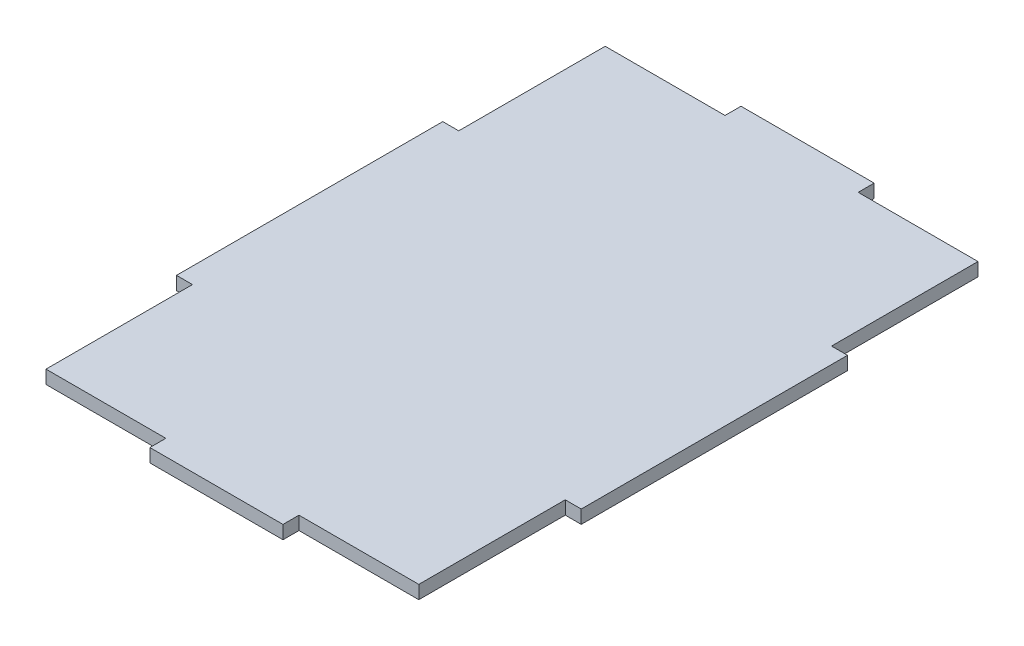
ISO-10303-21;
HEADER;
FILE_DESCRIPTION(('STEP AP214'),'2;1');
FILE_NAME('part.step','',(''),(''),'','','');
FILE_SCHEMA(('AUTOMOTIVE_DESIGN { 1 0 10303 214 1 1 1 1 }'));
ENDSEC;
DATA;
#1=APPLICATION_CONTEXT('core data for automotive mechanical design processes');
#2=APPLICATION_PROTOCOL_DEFINITION('international standard','automotive_design',2000,#1);
#3=PRODUCT_CONTEXT('',#1,'mechanical');
#4=PRODUCT('Part','Part','',(#3));
#5=PRODUCT_RELATED_PRODUCT_CATEGORY('part','',(#4));
#6=PRODUCT_DEFINITION_FORMATION('','',#4);
#7=PRODUCT_DEFINITION_CONTEXT('part definition',#1,'design');
#8=PRODUCT_DEFINITION('design','',#6,#7);
#9=PRODUCT_DEFINITION_SHAPE('','',#8);
#10=(LENGTH_UNIT() NAMED_UNIT(*) SI_UNIT(.MILLI.,.METRE.));
#11=(NAMED_UNIT(*) PLANE_ANGLE_UNIT() SI_UNIT($,.RADIAN.));
#12=(NAMED_UNIT(*) SI_UNIT($,.STERADIAN.) SOLID_ANGLE_UNIT());
#13=UNCERTAINTY_MEASURE_WITH_UNIT(LENGTH_MEASURE(1.E-05),#10,'distance_accuracy_value','');
#14=(GEOMETRIC_REPRESENTATION_CONTEXT(3) GLOBAL_UNCERTAINTY_ASSIGNED_CONTEXT((#13)) GLOBAL_UNIT_ASSIGNED_CONTEXT((#10,
#11,#12)) REPRESENTATION_CONTEXT('',''));
#15=CARTESIAN_POINT('',(0.,0.,0.));
#16=DIRECTION('',(0.,0.,1.));
#17=DIRECTION('',(1.,0.,0.));
#18=AXIS2_PLACEMENT_3D('',#15,#16,#17);
#19=CARTESIAN_POINT('',(-15.875,3.175,-66.675));
#20=DIRECTION('',(0.,0.,1.));
#21=DIRECTION('',(1.,0.,0.));
#22=AXIS2_PLACEMENT_3D('',#19,#20,#21);
#23=PLANE('',#22);
#24=DIRECTION('',(-1.,0.,0.));
#25=VECTOR('',#24,1.);
#26=CARTESIAN_POINT('',(-15.875,0.,-66.675));
#27=LINE('',#26,#25);
#28=CARTESIAN_POINT('',(-15.875,0.,-66.675));
#29=VERTEX_POINT('',#28);
#30=CARTESIAN_POINT('',(-44.45,0.,-66.675));
#31=VERTEX_POINT('',#30);
#32=EDGE_CURVE('E203',#29,#31,#27,.T.);
#33=ORIENTED_EDGE('',*,*,#32,.T.);
#34=DIRECTION('',(0.,-1.,0.));
#35=VECTOR('',#34,1.);
#36=CARTESIAN_POINT('',(-44.45,3.175,-66.675));
#37=LINE('',#36,#35);
#38=CARTESIAN_POINT('',(-44.45,3.175,-66.675));
#39=VERTEX_POINT('',#38);
#40=EDGE_CURVE('E11',#39,#31,#37,.T.);
#41=ORIENTED_EDGE('',*,*,#40,.F.);
#42=DIRECTION('',(-1.,0.,0.));
#43=VECTOR('',#42,1.);
#44=CARTESIAN_POINT('',(-15.875,3.175,-66.675));
#45=LINE('',#44,#43);
#46=CARTESIAN_POINT('',(-15.875,3.175,-66.675));
#47=VERTEX_POINT('',#46);
#48=EDGE_CURVE('E241',#47,#39,#45,.T.);
#49=ORIENTED_EDGE('',*,*,#48,.F.);
#50=DIRECTION('',(0.,-1.,0.));
#51=VECTOR('',#50,1.);
#52=CARTESIAN_POINT('',(-15.875,3.175,-66.675));
#53=LINE('',#52,#51);
#54=EDGE_CURVE('E199',#47,#29,#53,.T.);
#55=ORIENTED_EDGE('',*,*,#54,.T.);
#56=EDGE_LOOP('',(#33,#41,#49,#55));
#57=FACE_BOUND('',#56,.T.);
#58=ADVANCED_FACE('F35',(#57),#23,.F.);
#59=CARTESIAN_POINT('',(-44.45,3.175,-66.675));
#60=DIRECTION('',(1.,0.,0.));
#61=DIRECTION('',(0.,0.,-1.));
#62=AXIS2_PLACEMENT_3D('',#59,#60,#61);
#63=PLANE('',#62);
#64=DIRECTION('',(0.,0.,1.));
#65=VECTOR('',#64,1.);
#66=CARTESIAN_POINT('',(-44.45,0.,-66.675));
#67=LINE('',#66,#65);
#68=CARTESIAN_POINT('',(-44.45,0.,-31.75));
#69=VERTEX_POINT('',#68);
#70=EDGE_CURVE('E206',#31,#69,#67,.T.);
#71=ORIENTED_EDGE('',*,*,#70,.T.);
#72=DIRECTION('',(0.,-1.,0.));
#73=VECTOR('',#72,1.);
#74=CARTESIAN_POINT('',(-44.45,3.175,-31.75));
#75=LINE('',#74,#73);
#76=CARTESIAN_POINT('',(-44.45,3.175,-31.75));
#77=VERTEX_POINT('',#76);
#78=EDGE_CURVE('E43',#77,#69,#75,.T.);
#79=ORIENTED_EDGE('',*,*,#78,.F.);
#80=DIRECTION('',(0.,0.,1.));
#81=VECTOR('',#80,1.);
#82=CARTESIAN_POINT('',(-44.45,3.175,-66.675));
#83=LINE('',#82,#81);
#84=EDGE_CURVE('E130',#39,#77,#83,.T.);
#85=ORIENTED_EDGE('',*,*,#84,.F.);
#86=ORIENTED_EDGE('',*,*,#40,.T.);
#87=EDGE_LOOP('',(#71,#79,#85,#86));
#88=FACE_BOUND('',#87,.T.);
#89=ADVANCED_FACE('F359',(#88),#63,.F.);
#90=CARTESIAN_POINT('',(-44.45,3.175,-31.75));
#91=DIRECTION('',(0.,0.,1.));
#92=DIRECTION('',(1.,0.,0.));
#93=AXIS2_PLACEMENT_3D('',#90,#91,#92);
#94=PLANE('',#93);
#95=DIRECTION('',(-1.,0.,0.));
#96=VECTOR('',#95,1.);
#97=CARTESIAN_POINT('',(-44.45,0.,-31.75));
#98=LINE('',#97,#96);
#99=CARTESIAN_POINT('',(-48.26,0.,-31.75));
#100=VERTEX_POINT('',#99);
#101=EDGE_CURVE('E208',#69,#100,#98,.T.);
#102=ORIENTED_EDGE('',*,*,#101,.T.);
#103=DIRECTION('',(0.,-1.,0.));
#104=VECTOR('',#103,1.);
#105=CARTESIAN_POINT('',(-48.26,3.175,-31.75));
#106=LINE('',#105,#104);
#107=CARTESIAN_POINT('',(-48.26,3.175,-31.75));
#108=VERTEX_POINT('',#107);
#109=EDGE_CURVE('E284',#108,#100,#106,.T.);
#110=ORIENTED_EDGE('',*,*,#109,.F.);
#111=DIRECTION('',(-1.,0.,0.));
#112=VECTOR('',#111,1.);
#113=CARTESIAN_POINT('',(-44.45,3.175,-31.75));
#114=LINE('',#113,#112);
#115=EDGE_CURVE('E292',#77,#108,#114,.T.);
#116=ORIENTED_EDGE('',*,*,#115,.F.);
#117=ORIENTED_EDGE('',*,*,#78,.T.);
#118=EDGE_LOOP('',(#102,#110,#116,#117));
#119=FACE_BOUND('',#118,.T.);
#120=ADVANCED_FACE('F290',(#119),#94,.F.);
#121=CARTESIAN_POINT('',(-48.26,3.175,-31.75));
#122=DIRECTION('',(1.,0.,0.));
#123=DIRECTION('',(0.,0.,-1.));
#124=AXIS2_PLACEMENT_3D('',#121,#122,#123);
#125=PLANE('',#124);
#126=DIRECTION('',(0.,0.,1.));
#127=VECTOR('',#126,1.);
#128=CARTESIAN_POINT('',(-48.26,0.,-31.75));
#129=LINE('',#128,#127);
#130=CARTESIAN_POINT('',(-48.26,0.,31.75));
#131=VERTEX_POINT('',#130);
#132=EDGE_CURVE('E210',#100,#131,#129,.T.);
#133=ORIENTED_EDGE('',*,*,#132,.T.);
#134=DIRECTION('',(0.,-1.,0.));
#135=VECTOR('',#134,1.);
#136=CARTESIAN_POINT('',(-48.26,3.175,31.75));
#137=LINE('',#136,#135);
#138=CARTESIAN_POINT('',(-48.26,3.175,31.75));
#139=VERTEX_POINT('',#138);
#140=EDGE_CURVE('E281',#139,#131,#137,.T.);
#141=ORIENTED_EDGE('',*,*,#140,.F.);
#142=DIRECTION('',(0.,0.,1.));
#143=VECTOR('',#142,1.);
#144=CARTESIAN_POINT('',(-48.26,3.175,-31.75));
#145=LINE('',#144,#143);
#146=EDGE_CURVE('E310',#108,#139,#145,.T.);
#147=ORIENTED_EDGE('',*,*,#146,.F.);
#148=ORIENTED_EDGE('',*,*,#109,.T.);
#149=EDGE_LOOP('',(#133,#141,#147,#148));
#150=FACE_BOUND('',#149,.T.);
#151=ADVANCED_FACE('F301',(#150),#125,.F.);
#152=CARTESIAN_POINT('',(-44.45,3.175,31.75));
#153=DIRECTION('',(0.,0.,-1.));
#154=DIRECTION('',(-1.,0.,0.));
#155=AXIS2_PLACEMENT_3D('',#152,#153,#154);
#156=PLANE('',#155);
#157=DIRECTION('',(1.,0.,0.));
#158=VECTOR('',#157,1.);
#159=CARTESIAN_POINT('',(-44.45,0.,31.75));
#160=LINE('',#159,#158);
#161=CARTESIAN_POINT('',(-44.45,0.,31.75));
#162=VERTEX_POINT('',#161);
#163=EDGE_CURVE('E212',#131,#162,#160,.T.);
#164=ORIENTED_EDGE('',*,*,#163,.T.);
#165=DIRECTION('',(0.,-1.,0.));
#166=VECTOR('',#165,1.);
#167=CARTESIAN_POINT('',(-44.45,3.175,31.75));
#168=LINE('',#167,#166);
#169=CARTESIAN_POINT('',(-44.45,3.175,31.75));
#170=VERTEX_POINT('',#169);
#171=EDGE_CURVE('E278',#170,#162,#168,.T.);
#172=ORIENTED_EDGE('',*,*,#171,.F.);
#173=DIRECTION('',(1.,0.,0.));
#174=VECTOR('',#173,1.);
#175=CARTESIAN_POINT('',(-44.45,3.175,31.75));
#176=LINE('',#175,#174);
#177=EDGE_CURVE('E307',#139,#170,#176,.T.);
#178=ORIENTED_EDGE('',*,*,#177,.F.);
#179=ORIENTED_EDGE('',*,*,#140,.T.);
#180=EDGE_LOOP('',(#164,#172,#178,#179));
#181=FACE_BOUND('',#180,.T.);
#182=ADVANCED_FACE('F305',(#181),#156,.F.);
#183=CARTESIAN_POINT('',(-44.45,3.175,31.75));
#184=DIRECTION('',(1.,0.,0.));
#185=DIRECTION('',(0.,0.,-1.));
#186=AXIS2_PLACEMENT_3D('',#183,#184,#185);
#187=PLANE('',#186);
#188=DIRECTION('',(0.,0.,1.));
#189=VECTOR('',#188,1.);
#190=CARTESIAN_POINT('',(-44.45,0.,31.75));
#191=LINE('',#190,#189);
#192=CARTESIAN_POINT('',(-44.45,0.,66.675));
#193=VERTEX_POINT('',#192);
#194=EDGE_CURVE('E214',#162,#193,#191,.T.);
#195=ORIENTED_EDGE('',*,*,#194,.T.);
#196=DIRECTION('',(0.,-1.,0.));
#197=VECTOR('',#196,1.);
#198=CARTESIAN_POINT('',(-44.45,3.175,66.675));
#199=LINE('',#198,#197);
#200=CARTESIAN_POINT('',(-44.45,3.175,66.675));
#201=VERTEX_POINT('',#200);
#202=EDGE_CURVE('E275',#201,#193,#199,.T.);
#203=ORIENTED_EDGE('',*,*,#202,.F.);
#204=DIRECTION('',(0.,0.,1.));
#205=VECTOR('',#204,1.);
#206=CARTESIAN_POINT('',(-44.45,3.175,31.75));
#207=LINE('',#206,#205);
#208=EDGE_CURVE('E309',#170,#201,#207,.T.);
#209=ORIENTED_EDGE('',*,*,#208,.F.);
#210=ORIENTED_EDGE('',*,*,#171,.T.);
#211=EDGE_LOOP('',(#195,#203,#209,#210));
#212=FACE_BOUND('',#211,.T.);
#213=ADVANCED_FACE('F372',(#212),#187,.F.);
#214=CARTESIAN_POINT('',(-44.45,3.175,66.675));
#215=DIRECTION('',(0.,0.,-1.));
#216=DIRECTION('',(-1.,0.,0.));
#217=AXIS2_PLACEMENT_3D('',#214,#215,#216);
#218=PLANE('',#217);
#219=DIRECTION('',(1.,0.,0.));
#220=VECTOR('',#219,1.);
#221=CARTESIAN_POINT('',(-44.45,0.,66.675));
#222=LINE('',#221,#220);
#223=CARTESIAN_POINT('',(-15.875,0.,66.675));
#224=VERTEX_POINT('',#223);
#225=EDGE_CURVE('E216',#193,#224,#222,.T.);
#226=ORIENTED_EDGE('',*,*,#225,.T.);
#227=DIRECTION('',(0.,-1.,0.));
#228=VECTOR('',#227,1.);
#229=CARTESIAN_POINT('',(-15.875,3.175,66.675));
#230=LINE('',#229,#228);
#231=CARTESIAN_POINT('',(-15.875,3.175,66.675));
#232=VERTEX_POINT('',#231);
#233=EDGE_CURVE('E272',#232,#224,#230,.T.);
#234=ORIENTED_EDGE('',*,*,#233,.F.);
#235=DIRECTION('',(1.,0.,0.));
#236=VECTOR('',#235,1.);
#237=CARTESIAN_POINT('',(-44.45,3.175,66.675));
#238=LINE('',#237,#236);
#239=EDGE_CURVE('E312',#201,#232,#238,.T.);
#240=ORIENTED_EDGE('',*,*,#239,.F.);
#241=ORIENTED_EDGE('',*,*,#202,.T.);
#242=EDGE_LOOP('',(#226,#234,#240,#241));
#243=FACE_BOUND('',#242,.T.);
#244=ADVANCED_FACE('F375',(#243),#218,.F.);
#245=CARTESIAN_POINT('',(-15.875,3.175,66.675));
#246=DIRECTION('',(1.,0.,0.));
#247=DIRECTION('',(0.,0.,-1.));
#248=AXIS2_PLACEMENT_3D('',#245,#246,#247);
#249=PLANE('',#248);
#250=DIRECTION('',(0.,0.,1.));
#251=VECTOR('',#250,1.);
#252=CARTESIAN_POINT('',(-15.875,0.,66.675));
#253=LINE('',#252,#251);
#254=CARTESIAN_POINT('',(-15.875,0.,70.485));
#255=VERTEX_POINT('',#254);
#256=EDGE_CURVE('E218',#224,#255,#253,.T.);
#257=ORIENTED_EDGE('',*,*,#256,.T.);
#258=DIRECTION('',(0.,-1.,0.));
#259=VECTOR('',#258,1.);
#260=CARTESIAN_POINT('',(-15.875,3.175,70.485));
#261=LINE('',#260,#259);
#262=CARTESIAN_POINT('',(-15.875,3.175,70.485));
#263=VERTEX_POINT('',#262);
#264=EDGE_CURVE('E269',#263,#255,#261,.T.);
#265=ORIENTED_EDGE('',*,*,#264,.F.);
#266=DIRECTION('',(0.,0.,1.));
#267=VECTOR('',#266,1.);
#268=CARTESIAN_POINT('',(-15.875,3.175,66.675));
#269=LINE('',#268,#267);
#270=EDGE_CURVE('E318',#232,#263,#269,.T.);
#271=ORIENTED_EDGE('',*,*,#270,.F.);
#272=ORIENTED_EDGE('',*,*,#233,.T.);
#273=EDGE_LOOP('',(#257,#265,#271,#272));
#274=FACE_BOUND('',#273,.T.);
#275=ADVANCED_FACE('F379',(#274),#249,.F.);
#276=CARTESIAN_POINT('',(-15.875,3.175,70.485));
#277=DIRECTION('',(0.,0.,-1.));
#278=DIRECTION('',(-1.,0.,0.));
#279=AXIS2_PLACEMENT_3D('',#276,#277,#278);
#280=PLANE('',#279);
#281=DIRECTION('',(1.,0.,0.));
#282=VECTOR('',#281,1.);
#283=CARTESIAN_POINT('',(-15.875,0.,70.485));
#284=LINE('',#283,#282);
#285=CARTESIAN_POINT('',(15.875,0.,70.485));
#286=VERTEX_POINT('',#285);
#287=EDGE_CURVE('E220',#255,#286,#284,.T.);
#288=ORIENTED_EDGE('',*,*,#287,.T.);
#289=DIRECTION('',(0.,-1.,0.));
#290=VECTOR('',#289,1.);
#291=CARTESIAN_POINT('',(15.875,3.175,70.485));
#292=LINE('',#291,#290);
#293=CARTESIAN_POINT('',(15.875,3.175,70.485));
#294=VERTEX_POINT('',#293);
#295=EDGE_CURVE('E266',#294,#286,#292,.T.);
#296=ORIENTED_EDGE('',*,*,#295,.F.);
#297=DIRECTION('',(1.,0.,0.));
#298=VECTOR('',#297,1.);
#299=CARTESIAN_POINT('',(-15.875,3.175,70.485));
#300=LINE('',#299,#298);
#301=EDGE_CURVE('E320',#263,#294,#300,.T.);
#302=ORIENTED_EDGE('',*,*,#301,.F.);
#303=ORIENTED_EDGE('',*,*,#264,.T.);
#304=EDGE_LOOP('',(#288,#296,#302,#303));
#305=FACE_BOUND('',#304,.T.);
#306=ADVANCED_FACE('F383',(#305),#280,.F.);
#307=CARTESIAN_POINT('',(15.875,3.175,66.675));
#308=DIRECTION('',(-1.,0.,0.));
#309=DIRECTION('',(0.,0.,1.));
#310=AXIS2_PLACEMENT_3D('',#307,#308,#309);
#311=PLANE('',#310);
#312=DIRECTION('',(0.,0.,-1.));
#313=VECTOR('',#312,1.);
#314=CARTESIAN_POINT('',(15.875,0.,66.675));
#315=LINE('',#314,#313);
#316=CARTESIAN_POINT('',(15.875,0.,66.675));
#317=VERTEX_POINT('',#316);
#318=EDGE_CURVE('E222',#286,#317,#315,.T.);
#319=ORIENTED_EDGE('',*,*,#318,.T.);
#320=DIRECTION('',(0.,-1.,0.));
#321=VECTOR('',#320,1.);
#322=CARTESIAN_POINT('',(15.875,3.175,66.675));
#323=LINE('',#322,#321);
#324=CARTESIAN_POINT('',(15.875,3.175,66.675));
#325=VERTEX_POINT('',#324);
#326=EDGE_CURVE('E263',#325,#317,#323,.T.);
#327=ORIENTED_EDGE('',*,*,#326,.F.);
#328=DIRECTION('',(0.,0.,-1.));
#329=VECTOR('',#328,1.);
#330=CARTESIAN_POINT('',(15.875,3.175,66.675));
#331=LINE('',#330,#329);
#332=EDGE_CURVE('E322',#294,#325,#331,.T.);
#333=ORIENTED_EDGE('',*,*,#332,.F.);
#334=ORIENTED_EDGE('',*,*,#295,.T.);
#335=EDGE_LOOP('',(#319,#327,#333,#334));
#336=FACE_BOUND('',#335,.T.);
#337=ADVANCED_FACE('F387',(#336),#311,.F.);
#338=CARTESIAN_POINT('',(15.875,3.175,66.675));
#339=DIRECTION('',(0.,0.,-1.));
#340=DIRECTION('',(-1.,0.,0.));
#341=AXIS2_PLACEMENT_3D('',#338,#339,#340);
#342=PLANE('',#341);
#343=DIRECTION('',(1.,0.,0.));
#344=VECTOR('',#343,1.);
#345=CARTESIAN_POINT('',(15.875,0.,66.675));
#346=LINE('',#345,#344);
#347=CARTESIAN_POINT('',(44.45,0.,66.675));
#348=VERTEX_POINT('',#347);
#349=EDGE_CURVE('E224',#317,#348,#346,.T.);
#350=ORIENTED_EDGE('',*,*,#349,.T.);
#351=DIRECTION('',(0.,-1.,0.));
#352=VECTOR('',#351,1.);
#353=CARTESIAN_POINT('',(44.45,3.175,66.675));
#354=LINE('',#353,#352);
#355=CARTESIAN_POINT('',(44.45,3.175,66.675));
#356=VERTEX_POINT('',#355);
#357=EDGE_CURVE('E260',#356,#348,#354,.T.);
#358=ORIENTED_EDGE('',*,*,#357,.F.);
#359=DIRECTION('',(1.,0.,0.));
#360=VECTOR('',#359,1.);
#361=CARTESIAN_POINT('',(15.875,3.175,66.675));
#362=LINE('',#361,#360);
#363=EDGE_CURVE('E324',#325,#356,#362,.T.);
#364=ORIENTED_EDGE('',*,*,#363,.F.);
#365=ORIENTED_EDGE('',*,*,#326,.T.);
#366=EDGE_LOOP('',(#350,#358,#364,#365));
#367=FACE_BOUND('',#366,.T.);
#368=ADVANCED_FACE('F391',(#367),#342,.F.);
#369=CARTESIAN_POINT('',(44.45,3.175,31.75));
#370=DIRECTION('',(-1.,0.,0.));
#371=DIRECTION('',(0.,0.,1.));
#372=AXIS2_PLACEMENT_3D('',#369,#370,#371);
#373=PLANE('',#372);
#374=DIRECTION('',(0.,0.,-1.));
#375=VECTOR('',#374,1.);
#376=CARTESIAN_POINT('',(44.45,0.,31.75));
#377=LINE('',#376,#375);
#378=CARTESIAN_POINT('',(44.45,0.,31.75));
#379=VERTEX_POINT('',#378);
#380=EDGE_CURVE('E226',#348,#379,#377,.T.);
#381=ORIENTED_EDGE('',*,*,#380,.T.);
#382=DIRECTION('',(0.,-1.,0.));
#383=VECTOR('',#382,1.);
#384=CARTESIAN_POINT('',(44.45,3.175,31.75));
#385=LINE('',#384,#383);
#386=CARTESIAN_POINT('',(44.45,3.175,31.75));
#387=VERTEX_POINT('',#386);
#388=EDGE_CURVE('E257',#387,#379,#385,.T.);
#389=ORIENTED_EDGE('',*,*,#388,.F.);
#390=DIRECTION('',(0.,0.,-1.));
#391=VECTOR('',#390,1.);
#392=CARTESIAN_POINT('',(44.45,3.175,31.75));
#393=LINE('',#392,#391);
#394=EDGE_CURVE('E326',#356,#387,#393,.T.);
#395=ORIENTED_EDGE('',*,*,#394,.F.);
#396=ORIENTED_EDGE('',*,*,#357,.T.);
#397=EDGE_LOOP('',(#381,#389,#395,#396));
#398=FACE_BOUND('',#397,.T.);
#399=ADVANCED_FACE('F395',(#398),#373,.F.);
#400=CARTESIAN_POINT('',(44.45,3.175,31.75));
#401=DIRECTION('',(0.,0.,-1.));
#402=DIRECTION('',(-1.,0.,0.));
#403=AXIS2_PLACEMENT_3D('',#400,#401,#402);
#404=PLANE('',#403);
#405=DIRECTION('',(1.,0.,0.));
#406=VECTOR('',#405,1.);
#407=CARTESIAN_POINT('',(44.45,0.,31.75));
#408=LINE('',#407,#406);
#409=CARTESIAN_POINT('',(48.26,0.,31.75));
#410=VERTEX_POINT('',#409);
#411=EDGE_CURVE('E228',#379,#410,#408,.T.);
#412=ORIENTED_EDGE('',*,*,#411,.T.);
#413=DIRECTION('',(0.,-1.,0.));
#414=VECTOR('',#413,1.);
#415=CARTESIAN_POINT('',(48.26,3.175,31.75));
#416=LINE('',#415,#414);
#417=CARTESIAN_POINT('',(48.26,3.175,31.75));
#418=VERTEX_POINT('',#417);
#419=EDGE_CURVE('E254',#418,#410,#416,.T.);
#420=ORIENTED_EDGE('',*,*,#419,.F.);
#421=DIRECTION('',(1.,0.,0.));
#422=VECTOR('',#421,1.);
#423=CARTESIAN_POINT('',(44.45,3.175,31.75));
#424=LINE('',#423,#422);
#425=EDGE_CURVE('E328',#387,#418,#424,.T.);
#426=ORIENTED_EDGE('',*,*,#425,.F.);
#427=ORIENTED_EDGE('',*,*,#388,.T.);
#428=EDGE_LOOP('',(#412,#420,#426,#427));
#429=FACE_BOUND('',#428,.T.);
#430=ADVANCED_FACE('F399',(#429),#404,.F.);
#431=CARTESIAN_POINT('',(48.26,3.175,-31.75));
#432=DIRECTION('',(-1.,0.,0.));
#433=DIRECTION('',(0.,0.,1.));
#434=AXIS2_PLACEMENT_3D('',#431,#432,#433);
#435=PLANE('',#434);
#436=DIRECTION('',(0.,0.,-1.));
#437=VECTOR('',#436,1.);
#438=CARTESIAN_POINT('',(48.26,0.,-31.75));
#439=LINE('',#438,#437);
#440=CARTESIAN_POINT('',(48.26,0.,-31.75));
#441=VERTEX_POINT('',#440);
#442=EDGE_CURVE('E230',#410,#441,#439,.T.);
#443=ORIENTED_EDGE('',*,*,#442,.T.);
#444=DIRECTION('',(0.,-1.,0.));
#445=VECTOR('',#444,1.);
#446=CARTESIAN_POINT('',(48.26,3.175,-31.75));
#447=LINE('',#446,#445);
#448=CARTESIAN_POINT('',(48.26,3.175,-31.75));
#449=VERTEX_POINT('',#448);
#450=EDGE_CURVE('E251',#449,#441,#447,.T.);
#451=ORIENTED_EDGE('',*,*,#450,.F.);
#452=DIRECTION('',(0.,0.,-1.));
#453=VECTOR('',#452,1.);
#454=CARTESIAN_POINT('',(48.26,3.175,-31.75));
#455=LINE('',#454,#453);
#456=EDGE_CURVE('E330',#418,#449,#455,.T.);
#457=ORIENTED_EDGE('',*,*,#456,.F.);
#458=ORIENTED_EDGE('',*,*,#419,.T.);
#459=EDGE_LOOP('',(#443,#451,#457,#458));
#460=FACE_BOUND('',#459,.T.);
#461=ADVANCED_FACE('F403',(#460),#435,.F.);
#462=CARTESIAN_POINT('',(44.45,3.175,-31.75));
#463=DIRECTION('',(0.,0.,1.));
#464=DIRECTION('',(1.,0.,0.));
#465=AXIS2_PLACEMENT_3D('',#462,#463,#464);
#466=PLANE('',#465);
#467=DIRECTION('',(-1.,0.,0.));
#468=VECTOR('',#467,1.);
#469=CARTESIAN_POINT('',(44.45,0.,-31.75));
#470=LINE('',#469,#468);
#471=CARTESIAN_POINT('',(44.45,0.,-31.75));
#472=VERTEX_POINT('',#471);
#473=EDGE_CURVE('E232',#441,#472,#470,.T.);
#474=ORIENTED_EDGE('',*,*,#473,.T.);
#475=DIRECTION('',(0.,-1.,0.));
#476=VECTOR('',#475,1.);
#477=CARTESIAN_POINT('',(44.45,3.175,-31.75));
#478=LINE('',#477,#476);
#479=CARTESIAN_POINT('',(44.45,3.175,-31.75));
#480=VERTEX_POINT('',#479);
#481=EDGE_CURVE('E248',#480,#472,#478,.T.);
#482=ORIENTED_EDGE('',*,*,#481,.F.);
#483=DIRECTION('',(-1.,0.,0.));
#484=VECTOR('',#483,1.);
#485=CARTESIAN_POINT('',(44.45,3.175,-31.75));
#486=LINE('',#485,#484);
#487=EDGE_CURVE('E332',#449,#480,#486,.T.);
#488=ORIENTED_EDGE('',*,*,#487,.F.);
#489=ORIENTED_EDGE('',*,*,#450,.T.);
#490=EDGE_LOOP('',(#474,#482,#488,#489));
#491=FACE_BOUND('',#490,.T.);
#492=ADVANCED_FACE('F407',(#491),#466,.F.);
#493=CARTESIAN_POINT('',(44.45,3.175,-66.675));
#494=DIRECTION('',(-1.,0.,0.));
#495=DIRECTION('',(0.,0.,1.));
#496=AXIS2_PLACEMENT_3D('',#493,#494,#495);
#497=PLANE('',#496);
#498=DIRECTION('',(0.,0.,-1.));
#499=VECTOR('',#498,1.);
#500=CARTESIAN_POINT('',(44.45,0.,-66.675));
#501=LINE('',#500,#499);
#502=CARTESIAN_POINT('',(44.45,0.,-66.675));
#503=VERTEX_POINT('',#502);
#504=EDGE_CURVE('E234',#472,#503,#501,.T.);
#505=ORIENTED_EDGE('',*,*,#504,.T.);
#506=DIRECTION('',(0.,-1.,0.));
#507=VECTOR('',#506,1.);
#508=CARTESIAN_POINT('',(44.45,3.175,-66.675));
#509=LINE('',#508,#507);
#510=CARTESIAN_POINT('',(44.45,3.175,-66.675));
#511=VERTEX_POINT('',#510);
#512=EDGE_CURVE('E245',#511,#503,#509,.T.);
#513=ORIENTED_EDGE('',*,*,#512,.F.);
#514=DIRECTION('',(0.,0.,-1.));
#515=VECTOR('',#514,1.);
#516=CARTESIAN_POINT('',(44.45,3.175,-66.675));
#517=LINE('',#516,#515);
#518=EDGE_CURVE('E334',#480,#511,#517,.T.);
#519=ORIENTED_EDGE('',*,*,#518,.F.);
#520=ORIENTED_EDGE('',*,*,#481,.T.);
#521=EDGE_LOOP('',(#505,#513,#519,#520));
#522=FACE_BOUND('',#521,.T.);
#523=ADVANCED_FACE('F340',(#522),#497,.F.);
#524=CARTESIAN_POINT('',(44.45,3.175,-66.675));
#525=DIRECTION('',(0.,0.,1.));
#526=DIRECTION('',(1.,0.,0.));
#527=AXIS2_PLACEMENT_3D('',#524,#525,#526);
#528=PLANE('',#527);
#529=DIRECTION('',(-1.,0.,0.));
#530=VECTOR('',#529,1.);
#531=CARTESIAN_POINT('',(44.45,0.,-66.675));
#532=LINE('',#531,#530);
#533=CARTESIAN_POINT('',(15.875,0.,-66.675));
#534=VERTEX_POINT('',#533);
#535=EDGE_CURVE('E236',#503,#534,#532,.T.);
#536=ORIENTED_EDGE('',*,*,#535,.T.);
#537=DIRECTION('',(0.,-1.,0.));
#538=VECTOR('',#537,1.);
#539=CARTESIAN_POINT('',(15.875,3.175,-66.675));
#540=LINE('',#539,#538);
#541=CARTESIAN_POINT('',(15.875,3.175,-66.675));
#542=VERTEX_POINT('',#541);
#543=EDGE_CURVE('E194',#542,#534,#540,.T.);
#544=ORIENTED_EDGE('',*,*,#543,.F.);
#545=DIRECTION('',(-1.,0.,0.));
#546=VECTOR('',#545,1.);
#547=CARTESIAN_POINT('',(44.45,3.175,-66.675));
#548=LINE('',#547,#546);
#549=EDGE_CURVE('E185',#511,#542,#548,.T.);
#550=ORIENTED_EDGE('',*,*,#549,.F.);
#551=ORIENTED_EDGE('',*,*,#512,.T.);
#552=EDGE_LOOP('',(#536,#544,#550,#551));
#553=FACE_BOUND('',#552,.T.);
#554=ADVANCED_FACE('F344',(#553),#528,.F.);
#555=CARTESIAN_POINT('',(15.875,3.175,-66.675));
#556=DIRECTION('',(-1.,0.,0.));
#557=DIRECTION('',(0.,0.,1.));
#558=AXIS2_PLACEMENT_3D('',#555,#556,#557);
#559=PLANE('',#558);
#560=DIRECTION('',(0.,0.,-1.));
#561=VECTOR('',#560,1.);
#562=CARTESIAN_POINT('',(15.875,0.,-66.675));
#563=LINE('',#562,#561);
#564=CARTESIAN_POINT('',(15.875,0.,-70.485));
#565=VERTEX_POINT('',#564);
#566=EDGE_CURVE('E193',#534,#565,#563,.T.);
#567=ORIENTED_EDGE('',*,*,#566,.T.);
#568=DIRECTION('',(0.,-1.,0.));
#569=VECTOR('',#568,1.);
#570=CARTESIAN_POINT('',(15.875,3.175,-70.485));
#571=LINE('',#570,#569);
#572=CARTESIAN_POINT('',(15.875,3.175,-70.485));
#573=VERTEX_POINT('',#572);
#574=EDGE_CURVE('E190',#573,#565,#571,.T.);
#575=ORIENTED_EDGE('',*,*,#574,.F.);
#576=DIRECTION('',(0.,0.,-1.));
#577=VECTOR('',#576,1.);
#578=CARTESIAN_POINT('',(15.875,3.175,-66.675));
#579=LINE('',#578,#577);
#580=EDGE_CURVE('E179',#542,#573,#579,.T.);
#581=ORIENTED_EDGE('',*,*,#580,.F.);
#582=ORIENTED_EDGE('',*,*,#543,.T.);
#583=EDGE_LOOP('',(#567,#575,#581,#582));
#584=FACE_BOUND('',#583,.T.);
#585=ADVANCED_FACE('F191',(#584),#559,.F.);
#586=CARTESIAN_POINT('',(-15.875,3.175,-70.485));
#587=DIRECTION('',(0.,0.,1.));
#588=DIRECTION('',(1.,0.,0.));
#589=AXIS2_PLACEMENT_3D('',#586,#587,#588);
#590=PLANE('',#589);
#591=DIRECTION('',(-1.,0.,0.));
#592=VECTOR('',#591,1.);
#593=CARTESIAN_POINT('',(-15.875,0.,-70.485));
#594=LINE('',#593,#592);
#595=CARTESIAN_POINT('',(-15.875,0.,-70.485));
#596=VERTEX_POINT('',#595);
#597=EDGE_CURVE('E116',#565,#596,#594,.T.);
#598=ORIENTED_EDGE('',*,*,#597,.T.);
#599=DIRECTION('',(0.,-1.,0.));
#600=VECTOR('',#599,1.);
#601=CARTESIAN_POINT('',(-15.875,3.175,-70.485));
#602=LINE('',#601,#600);
#603=CARTESIAN_POINT('',(-15.875,3.175,-70.485));
#604=VERTEX_POINT('',#603);
#605=EDGE_CURVE('E195',#604,#596,#602,.T.);
#606=ORIENTED_EDGE('',*,*,#605,.F.);
#607=DIRECTION('',(-1.,0.,0.));
#608=VECTOR('',#607,1.);
#609=CARTESIAN_POINT('',(-15.875,3.175,-70.485));
#610=LINE('',#609,#608);
#611=EDGE_CURVE('E183',#573,#604,#610,.T.);
#612=ORIENTED_EDGE('',*,*,#611,.F.);
#613=ORIENTED_EDGE('',*,*,#574,.T.);
#614=EDGE_LOOP('',(#598,#606,#612,#613));
#615=FACE_BOUND('',#614,.T.);
#616=ADVANCED_FACE('F197',(#615),#590,.F.);
#617=CARTESIAN_POINT('',(-15.875,3.175,-66.675));
#618=DIRECTION('',(1.,0.,0.));
#619=DIRECTION('',(0.,0.,-1.));
#620=AXIS2_PLACEMENT_3D('',#617,#618,#619);
#621=PLANE('',#620);
#622=DIRECTION('',(0.,0.,1.));
#623=VECTOR('',#622,1.);
#624=CARTESIAN_POINT('',(-15.875,0.,-66.675));
#625=LINE('',#624,#623);
#626=EDGE_CURVE('E122',#596,#29,#625,.T.);
#627=ORIENTED_EDGE('',*,*,#626,.T.);
#628=ORIENTED_EDGE('',*,*,#54,.F.);
#629=DIRECTION('',(0.,0.,1.));
#630=VECTOR('',#629,1.);
#631=CARTESIAN_POINT('',(-15.875,3.175,-66.675));
#632=LINE('',#631,#630);
#633=EDGE_CURVE('E51',#604,#47,#632,.T.);
#634=ORIENTED_EDGE('',*,*,#633,.F.);
#635=ORIENTED_EDGE('',*,*,#605,.T.);
#636=EDGE_LOOP('',(#627,#628,#634,#635));
#637=FACE_BOUND('',#636,.T.);
#638=ADVANCED_FACE('F348',(#637),#621,.F.);
#639=CARTESIAN_POINT('',(0.,3.175,0.));
#640=DIRECTION('',(0.,1.,0.));
#641=DIRECTION('',(0.,0.,1.));
#642=AXIS2_PLACEMENT_3D('',#639,#640,#641);
#643=PLANE('',#642);
#644=ORIENTED_EDGE('',*,*,#48,.T.);
#645=ORIENTED_EDGE('',*,*,#84,.T.);
#646=ORIENTED_EDGE('',*,*,#115,.T.);
#647=ORIENTED_EDGE('',*,*,#146,.T.);
#648=ORIENTED_EDGE('',*,*,#177,.T.);
#649=ORIENTED_EDGE('',*,*,#208,.T.);
#650=ORIENTED_EDGE('',*,*,#239,.T.);
#651=ORIENTED_EDGE('',*,*,#270,.T.);
#652=ORIENTED_EDGE('',*,*,#301,.T.);
#653=ORIENTED_EDGE('',*,*,#332,.T.);
#654=ORIENTED_EDGE('',*,*,#363,.T.);
#655=ORIENTED_EDGE('',*,*,#394,.T.);
#656=ORIENTED_EDGE('',*,*,#425,.T.);
#657=ORIENTED_EDGE('',*,*,#456,.T.);
#658=ORIENTED_EDGE('',*,*,#487,.T.);
#659=ORIENTED_EDGE('',*,*,#518,.T.);
#660=ORIENTED_EDGE('',*,*,#549,.T.);
#661=ORIENTED_EDGE('',*,*,#580,.T.);
#662=ORIENTED_EDGE('',*,*,#611,.T.);
#663=ORIENTED_EDGE('',*,*,#633,.T.);
#664=EDGE_LOOP('',(#644,#645,#646,#647,#648,#649,#650,#651,#652,#653,#654,#655,#656,#657,#658,
#659,#660,#661,#662,#663));
#665=FACE_BOUND('',#664,.T.);
#666=ADVANCED_FACE('F181',(#665),#643,.T.);
#667=CARTESIAN_POINT('',(0.,0.,0.));
#668=DIRECTION('',(0.,1.,0.));
#669=DIRECTION('',(0.,0.,1.));
#670=AXIS2_PLACEMENT_3D('',#667,#668,#669);
#671=PLANE('',#670);
#672=ORIENTED_EDGE('',*,*,#32,.F.);
#673=ORIENTED_EDGE('',*,*,#626,.F.);
#674=ORIENTED_EDGE('',*,*,#597,.F.);
#675=ORIENTED_EDGE('',*,*,#566,.F.);
#676=ORIENTED_EDGE('',*,*,#535,.F.);
#677=ORIENTED_EDGE('',*,*,#504,.F.);
#678=ORIENTED_EDGE('',*,*,#473,.F.);
#679=ORIENTED_EDGE('',*,*,#442,.F.);
#680=ORIENTED_EDGE('',*,*,#411,.F.);
#681=ORIENTED_EDGE('',*,*,#380,.F.);
#682=ORIENTED_EDGE('',*,*,#349,.F.);
#683=ORIENTED_EDGE('',*,*,#318,.F.);
#684=ORIENTED_EDGE('',*,*,#287,.F.);
#685=ORIENTED_EDGE('',*,*,#256,.F.);
#686=ORIENTED_EDGE('',*,*,#225,.F.);
#687=ORIENTED_EDGE('',*,*,#194,.F.);
#688=ORIENTED_EDGE('',*,*,#163,.F.);
#689=ORIENTED_EDGE('',*,*,#132,.F.);
#690=ORIENTED_EDGE('',*,*,#101,.F.);
#691=ORIENTED_EDGE('',*,*,#70,.F.);
#692=EDGE_LOOP('',(#672,#673,#674,#675,#676,#677,#678,#679,#680,#681,#682,#683,#684,#685,#686,
#687,#688,#689,#690,#691));
#693=FACE_BOUND('',#692,.T.);
#694=ADVANCED_FACE('F296',(#693),#671,.F.);
#695=CLOSED_SHELL('',(#58,#89,#120,#151,#182,#213,#244,#275,#306,#337,#368,#399,#430,#461,#492,
#523,#554,#585,#616,#638,#666,#694));
#696=MANIFOLD_SOLID_BREP('B2',#695);
#697=ADVANCED_BREP_SHAPE_REPRESENTATION('',(#18,#696),#14);
#698=SHAPE_DEFINITION_REPRESENTATION(#9,#697);
ENDSEC;
END-ISO-10303-21;
